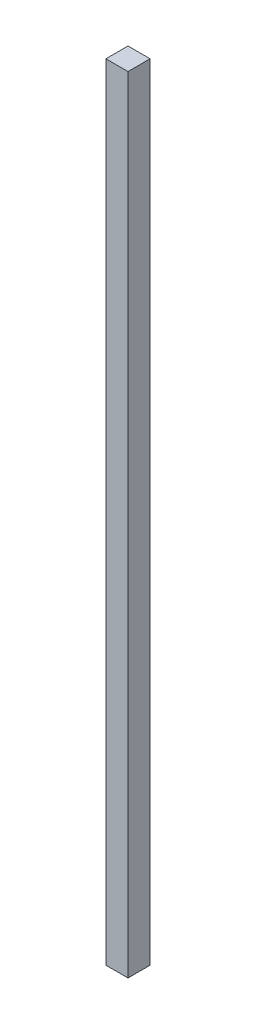
ISO-10303-21;
HEADER;
FILE_DESCRIPTION(('STEP AP214'),'2;1');
FILE_NAME('part.step','',(''),(''),'','','');
FILE_SCHEMA(('AUTOMOTIVE_DESIGN { 1 0 10303 214 1 1 1 1 }'));
ENDSEC;
DATA;
#1=APPLICATION_CONTEXT('core data for automotive mechanical design processes');
#2=APPLICATION_PROTOCOL_DEFINITION('international standard','automotive_design',2000,#1);
#3=PRODUCT_CONTEXT('',#1,'mechanical');
#4=PRODUCT('Part','Part','',(#3));
#5=PRODUCT_RELATED_PRODUCT_CATEGORY('part','',(#4));
#6=PRODUCT_DEFINITION_FORMATION('','',#4);
#7=PRODUCT_DEFINITION_CONTEXT('part definition',#1,'design');
#8=PRODUCT_DEFINITION('design','',#6,#7);
#9=PRODUCT_DEFINITION_SHAPE('','',#8);
#10=(LENGTH_UNIT() NAMED_UNIT(*) SI_UNIT(.MILLI.,.METRE.));
#11=(NAMED_UNIT(*) PLANE_ANGLE_UNIT() SI_UNIT($,.RADIAN.));
#12=(NAMED_UNIT(*) SI_UNIT($,.STERADIAN.) SOLID_ANGLE_UNIT());
#13=UNCERTAINTY_MEASURE_WITH_UNIT(LENGTH_MEASURE(1.E-05),#10,'distance_accuracy_value','');
#14=(GEOMETRIC_REPRESENTATION_CONTEXT(3) GLOBAL_UNCERTAINTY_ASSIGNED_CONTEXT((#13)) GLOBAL_UNIT_ASSIGNED_CONTEXT((#10,
#11,#12)) REPRESENTATION_CONTEXT('',''));
#15=CARTESIAN_POINT('',(0.,0.,0.));
#16=DIRECTION('',(0.,0.,1.));
#17=DIRECTION('',(1.,0.,0.));
#18=AXIS2_PLACEMENT_3D('',#15,#16,#17);
#19=CARTESIAN_POINT('',(0.,110.,0.));
#20=DIRECTION('',(1.,0.,0.));
#21=DIRECTION('',(0.,0.,-1.));
#22=AXIS2_PLACEMENT_3D('',#19,#20,#21);
#23=PLANE('',#22);
#24=DIRECTION('',(0.,0.,1.));
#25=VECTOR('',#24,1.);
#26=CARTESIAN_POINT('',(0.,0.,0.));
#27=LINE('',#26,#25);
#28=CARTESIAN_POINT('',(0.,0.,-3.1));
#29=VERTEX_POINT('',#28);
#30=CARTESIAN_POINT('',(0.,0.,0.));
#31=VERTEX_POINT('',#30);
#32=EDGE_CURVE('E113',#29,#31,#27,.T.);
#33=ORIENTED_EDGE('',*,*,#32,.T.);
#34=DIRECTION('',(0.,-1.,0.));
#35=VECTOR('',#34,1.);
#36=CARTESIAN_POINT('',(0.,110.,0.));
#37=LINE('',#36,#35);
#38=CARTESIAN_POINT('',(0.,110.,0.));
#39=VERTEX_POINT('',#38);
#40=EDGE_CURVE('E11',#39,#31,#37,.T.);
#41=ORIENTED_EDGE('',*,*,#40,.F.);
#42=DIRECTION('',(0.,0.,1.));
#43=VECTOR('',#42,1.);
#44=CARTESIAN_POINT('',(0.,110.,0.));
#45=LINE('',#44,#43);
#46=CARTESIAN_POINT('',(0.,110.,-3.1));
#47=VERTEX_POINT('',#46);
#48=EDGE_CURVE('E97',#47,#39,#45,.T.);
#49=ORIENTED_EDGE('',*,*,#48,.F.);
#50=DIRECTION('',(0.,-1.,0.));
#51=VECTOR('',#50,1.);
#52=CARTESIAN_POINT('',(0.,110.,-3.1));
#53=LINE('',#52,#51);
#54=EDGE_CURVE('E109',#47,#29,#53,.T.);
#55=ORIENTED_EDGE('',*,*,#54,.T.);
#56=EDGE_LOOP('',(#33,#41,#49,#55));
#57=FACE_BOUND('',#56,.T.);
#58=ADVANCED_FACE('F45',(#57),#23,.F.);
#59=CARTESIAN_POINT('',(0.,110.,0.));
#60=DIRECTION('',(0.,0.,-1.));
#61=DIRECTION('',(-1.,0.,0.));
#62=AXIS2_PLACEMENT_3D('',#59,#60,#61);
#63=PLANE('',#62);
#64=DIRECTION('',(1.,0.,0.));
#65=VECTOR('',#64,1.);
#66=CARTESIAN_POINT('',(0.,0.,0.));
#67=LINE('',#66,#65);
#68=CARTESIAN_POINT('',(3.1,0.,0.));
#69=VERTEX_POINT('',#68);
#70=EDGE_CURVE('E102',#31,#69,#67,.T.);
#71=ORIENTED_EDGE('',*,*,#70,.T.);
#72=DIRECTION('',(0.,-1.,0.));
#73=VECTOR('',#72,1.);
#74=CARTESIAN_POINT('',(3.1,110.,0.));
#75=LINE('',#74,#73);
#76=CARTESIAN_POINT('',(3.1,110.,0.));
#77=VERTEX_POINT('',#76);
#78=EDGE_CURVE('E54',#77,#69,#75,.T.);
#79=ORIENTED_EDGE('',*,*,#78,.F.);
#80=DIRECTION('',(1.,0.,0.));
#81=VECTOR('',#80,1.);
#82=CARTESIAN_POINT('',(0.,110.,0.));
#83=LINE('',#82,#81);
#84=EDGE_CURVE('E92',#39,#77,#83,.T.);
#85=ORIENTED_EDGE('',*,*,#84,.F.);
#86=ORIENTED_EDGE('',*,*,#40,.T.);
#87=EDGE_LOOP('',(#71,#79,#85,#86));
#88=FACE_BOUND('',#87,.T.);
#89=ADVANCED_FACE('F101',(#88),#63,.F.);
#90=CARTESIAN_POINT('',(3.1,110.,0.));
#91=DIRECTION('',(-1.,0.,0.));
#92=DIRECTION('',(0.,0.,1.));
#93=AXIS2_PLACEMENT_3D('',#90,#91,#92);
#94=PLANE('',#93);
#95=DIRECTION('',(0.,0.,-1.));
#96=VECTOR('',#95,1.);
#97=CARTESIAN_POINT('',(3.1,0.,0.));
#98=LINE('',#97,#96);
#99=CARTESIAN_POINT('',(3.1,0.,-3.1));
#100=VERTEX_POINT('',#99);
#101=EDGE_CURVE('E79',#69,#100,#98,.T.);
#102=ORIENTED_EDGE('',*,*,#101,.T.);
#103=DIRECTION('',(0.,-1.,0.));
#104=VECTOR('',#103,1.);
#105=CARTESIAN_POINT('',(3.1,110.,-3.1));
#106=LINE('',#105,#104);
#107=CARTESIAN_POINT('',(3.1,110.,-3.1));
#108=VERTEX_POINT('',#107);
#109=EDGE_CURVE('E104',#108,#100,#106,.T.);
#110=ORIENTED_EDGE('',*,*,#109,.F.);
#111=DIRECTION('',(0.,0.,-1.));
#112=VECTOR('',#111,1.);
#113=CARTESIAN_POINT('',(3.1,110.,0.));
#114=LINE('',#113,#112);
#115=EDGE_CURVE('E95',#77,#108,#114,.T.);
#116=ORIENTED_EDGE('',*,*,#115,.F.);
#117=ORIENTED_EDGE('',*,*,#78,.T.);
#118=EDGE_LOOP('',(#102,#110,#116,#117));
#119=FACE_BOUND('',#118,.T.);
#120=ADVANCED_FACE('F105',(#119),#94,.F.);
#121=CARTESIAN_POINT('',(0.,110.,-3.1));
#122=DIRECTION('',(0.,0.,1.));
#123=DIRECTION('',(1.,0.,0.));
#124=AXIS2_PLACEMENT_3D('',#121,#122,#123);
#125=PLANE('',#124);
#126=DIRECTION('',(-1.,0.,0.));
#127=VECTOR('',#126,1.);
#128=CARTESIAN_POINT('',(0.,0.,-3.1));
#129=LINE('',#128,#127);
#130=EDGE_CURVE('E85',#100,#29,#129,.T.);
#131=ORIENTED_EDGE('',*,*,#130,.T.);
#132=ORIENTED_EDGE('',*,*,#54,.F.);
#133=DIRECTION('',(-1.,0.,0.));
#134=VECTOR('',#133,1.);
#135=CARTESIAN_POINT('',(0.,110.,-3.1));
#136=LINE('',#135,#134);
#137=EDGE_CURVE('E62',#108,#47,#136,.T.);
#138=ORIENTED_EDGE('',*,*,#137,.F.);
#139=ORIENTED_EDGE('',*,*,#109,.T.);
#140=EDGE_LOOP('',(#131,#132,#138,#139));
#141=FACE_BOUND('',#140,.T.);
#142=ADVANCED_FACE('F126',(#141),#125,.F.);
#143=CARTESIAN_POINT('',(0.,110.,0.));
#144=DIRECTION('',(0.,-1.,0.));
#145=DIRECTION('',(0.,0.,-1.));
#146=AXIS2_PLACEMENT_3D('',#143,#144,#145);
#147=PLANE('',#146);
#148=ORIENTED_EDGE('',*,*,#48,.T.);
#149=ORIENTED_EDGE('',*,*,#84,.T.);
#150=ORIENTED_EDGE('',*,*,#115,.T.);
#151=ORIENTED_EDGE('',*,*,#137,.T.);
#152=EDGE_LOOP('',(#148,#149,#150,#151));
#153=FACE_BOUND('',#152,.T.);
#154=ADVANCED_FACE('F93',(#153),#147,.F.);
#155=CARTESIAN_POINT('',(0.,0.,0.));
#156=DIRECTION('',(0.,-1.,0.));
#157=DIRECTION('',(0.,0.,-1.));
#158=AXIS2_PLACEMENT_3D('',#155,#156,#157);
#159=PLANE('',#158);
#160=ORIENTED_EDGE('',*,*,#32,.F.);
#161=ORIENTED_EDGE('',*,*,#130,.F.);
#162=ORIENTED_EDGE('',*,*,#101,.F.);
#163=ORIENTED_EDGE('',*,*,#70,.F.);
#164=EDGE_LOOP('',(#160,#161,#162,#163));
#165=FACE_BOUND('',#164,.T.);
#166=ADVANCED_FACE('F129',(#165),#159,.T.);
#167=CLOSED_SHELL('',(#58,#89,#120,#142,#154,#166));
#168=MANIFOLD_SOLID_BREP('B2',#167);
#169=ADVANCED_BREP_SHAPE_REPRESENTATION('',(#18,#168),#14);
#170=SHAPE_DEFINITION_REPRESENTATION(#9,#169);
ENDSEC;
END-ISO-10303-21;
